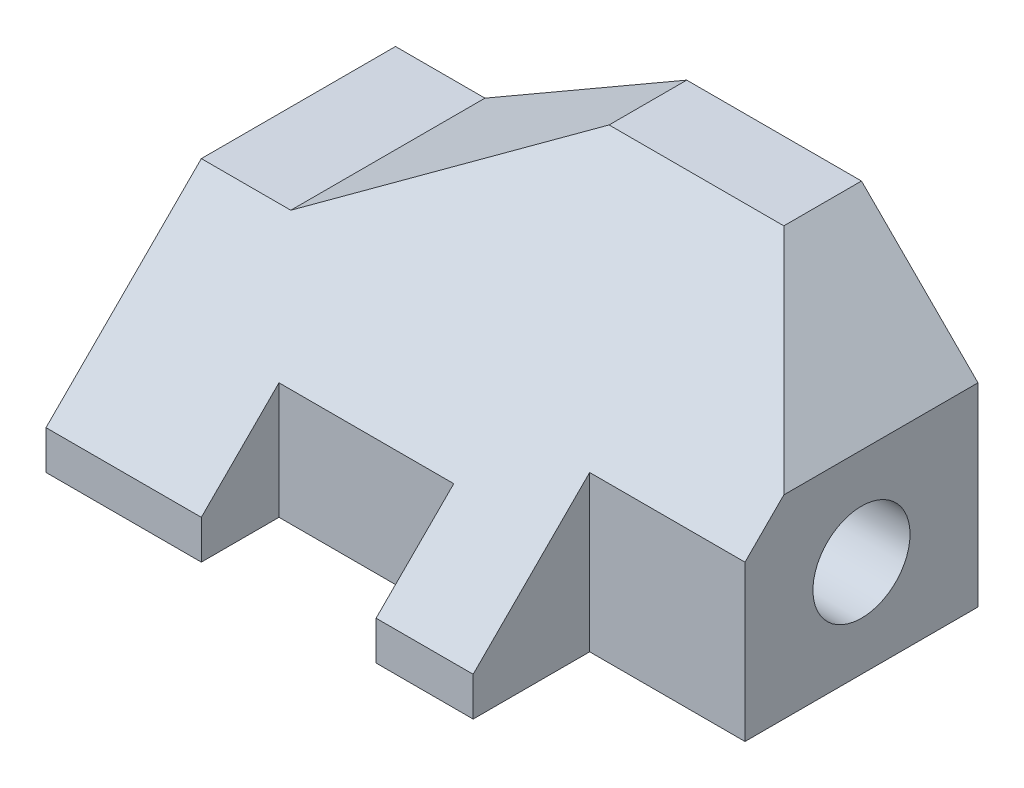
ISO-10303-21;
HEADER;
FILE_DESCRIPTION(('STEP AP214'),'2;1');
FILE_NAME('part.step','',(''),(''),'','','');
FILE_SCHEMA(('AUTOMOTIVE_DESIGN { 1 0 10303 214 1 1 1 1 }'));
ENDSEC;
DATA;
#1=APPLICATION_CONTEXT('core data for automotive mechanical design processes');
#2=APPLICATION_PROTOCOL_DEFINITION('international standard','automotive_design',2000,#1);
#3=PRODUCT_CONTEXT('',#1,'mechanical');
#4=PRODUCT('Part','Part','',(#3));
#5=PRODUCT_RELATED_PRODUCT_CATEGORY('part','',(#4));
#6=PRODUCT_DEFINITION_FORMATION('','',#4);
#7=PRODUCT_DEFINITION_CONTEXT('part definition',#1,'design');
#8=PRODUCT_DEFINITION('design','',#6,#7);
#9=PRODUCT_DEFINITION_SHAPE('','',#8);
#10=(LENGTH_UNIT() NAMED_UNIT(*) SI_UNIT(.MILLI.,.METRE.));
#11=(NAMED_UNIT(*) PLANE_ANGLE_UNIT() SI_UNIT($,.RADIAN.));
#12=(NAMED_UNIT(*) SI_UNIT($,.STERADIAN.) SOLID_ANGLE_UNIT());
#13=UNCERTAINTY_MEASURE_WITH_UNIT(LENGTH_MEASURE(1.E-05),#10,'distance_accuracy_value','');
#14=(GEOMETRIC_REPRESENTATION_CONTEXT(3) GLOBAL_UNCERTAINTY_ASSIGNED_CONTEXT((#13)) GLOBAL_UNIT_ASSIGNED_CONTEXT((#10,
#11,#12)) REPRESENTATION_CONTEXT('',''));
#15=CARTESIAN_POINT('',(0.,0.,0.));
#16=DIRECTION('',(0.,0.,1.));
#17=DIRECTION('',(1.,0.,0.));
#18=AXIS2_PLACEMENT_3D('',#15,#16,#17);
#19=CARTESIAN_POINT('',(-47.625,50.8,28.575));
#20=DIRECTION('',(0.,0.,-1.));
#21=DIRECTION('',(-1.,0.,0.));
#22=AXIS2_PLACEMENT_3D('',#19,#20,#21);
#23=PLANE('',#22);
#24=DIRECTION('',(0.,-1.,0.));
#25=VECTOR('',#24,1.);
#26=CARTESIAN_POINT('',(-22.225,127.,28.575));
#27=LINE('',#26,#25);
#28=CARTESIAN_POINT('',(-22.225,6.35000000000047,28.575));
#29=VERTEX_POINT('',#28);
#30=CARTESIAN_POINT('',(-22.225,0.,28.575));
#31=VERTEX_POINT('',#30);
#32=EDGE_CURVE('E175',#29,#31,#27,.T.);
#33=ORIENTED_EDGE('',*,*,#32,.F.);
#34=DIRECTION('',(1.,0.,0.));
#35=VECTOR('',#34,1.);
#36=CARTESIAN_POINT('',(-79.375,6.35000000000047,28.575));
#37=LINE('',#36,#35);
#38=CARTESIAN_POINT('',(-47.625,6.35000000000047,28.575));
#39=VERTEX_POINT('',#38);
#40=EDGE_CURVE('E208',#39,#29,#37,.T.);
#41=ORIENTED_EDGE('',*,*,#40,.F.);
#42=DIRECTION('',(0.,-1.,0.));
#43=VECTOR('',#42,1.);
#44=CARTESIAN_POINT('',(-47.625,50.8,28.575));
#45=LINE('',#44,#43);
#46=CARTESIAN_POINT('',(-47.625,0.,28.575));
#47=VERTEX_POINT('',#46);
#48=EDGE_CURVE('E257',#39,#47,#45,.T.);
#49=ORIENTED_EDGE('',*,*,#48,.T.);
#50=DIRECTION('',(1.,0.,0.));
#51=VECTOR('',#50,1.);
#52=CARTESIAN_POINT('',(-47.625,0.,28.575));
#53=LINE('',#52,#51);
#54=EDGE_CURVE('E258',#47,#31,#53,.T.);
#55=ORIENTED_EDGE('',*,*,#54,.T.);
#56=EDGE_LOOP('',(#33,#41,#49,#55));
#57=FACE_BOUND('',#56,.T.);
#58=ADVANCED_FACE('F43',(#57),#23,.F.);
#59=CARTESIAN_POINT('',(6.35,0.,28.575));
#60=VERTEX_POINT('',#59);
#61=CARTESIAN_POINT('',(22.225,0.,28.575));
#62=VERTEX_POINT('',#61);
#63=EDGE_CURVE('E269',#60,#62,#53,.T.);
#64=ORIENTED_EDGE('',*,*,#63,.T.);
#65=DIRECTION('',(0.,-1.,0.));
#66=VECTOR('',#65,1.);
#67=CARTESIAN_POINT('',(22.225,127.,28.575));
#68=LINE('',#67,#66);
#69=CARTESIAN_POINT('',(22.225,6.35000000000047,28.575));
#70=VERTEX_POINT('',#69);
#71=EDGE_CURVE('E179',#70,#62,#68,.T.);
#72=ORIENTED_EDGE('',*,*,#71,.F.);
#73=CARTESIAN_POINT('',(6.35,6.35000000000048,28.575));
#74=VERTEX_POINT('',#73);
#75=EDGE_CURVE('E213',#74,#70,#37,.T.);
#76=ORIENTED_EDGE('',*,*,#75,.F.);
#77=DIRECTION('',(0.,-1.,0.));
#78=VECTOR('',#77,1.);
#79=CARTESIAN_POINT('',(6.35,127.,28.575));
#80=LINE('',#79,#78);
#81=EDGE_CURVE('E197',#74,#60,#80,.T.);
#82=ORIENTED_EDGE('',*,*,#81,.T.);
#83=EDGE_LOOP('',(#64,#72,#76,#82));
#84=FACE_BOUND('',#83,.T.);
#85=ADVANCED_FACE('F354',(#84),#23,.F.);
#86=CARTESIAN_POINT('',(0.,0.,0.));
#87=DIRECTION('',(0.,-1.,0.));
#88=DIRECTION('',(0.,0.,-1.));
#89=AXIS2_PLACEMENT_3D('',#86,#87,#88);
#90=PLANE('',#89);
#91=DIRECTION('',(0.,0.,-1.));
#92=VECTOR('',#91,1.);
#93=CARTESIAN_POINT('',(22.225,0.,0.));
#94=LINE('',#93,#92);
#95=CARTESIAN_POINT('',(22.225,0.,9.52500000000001));
#96=VERTEX_POINT('',#95);
#97=EDGE_CURVE('E170',#62,#96,#94,.T.);
#98=ORIENTED_EDGE('',*,*,#97,.F.);
#99=ORIENTED_EDGE('',*,*,#63,.F.);
#100=DIRECTION('',(0.,0.,-1.));
#101=VECTOR('',#100,1.);
#102=CARTESIAN_POINT('',(6.35,0.,0.));
#103=LINE('',#102,#101);
#104=CARTESIAN_POINT('',(6.35,0.,15.875));
#105=VERTEX_POINT('',#104);
#106=EDGE_CURVE('E190',#60,#105,#103,.T.);
#107=ORIENTED_EDGE('',*,*,#106,.T.);
#108=DIRECTION('',(-1.,0.,0.));
#109=VECTOR('',#108,1.);
#110=CARTESIAN_POINT('',(0.,0.,15.875));
#111=LINE('',#110,#109);
#112=CARTESIAN_POINT('',(-22.225,0.,15.875));
#113=VERTEX_POINT('',#112);
#114=EDGE_CURVE('E165',#105,#113,#111,.T.);
#115=ORIENTED_EDGE('',*,*,#114,.T.);
#116=DIRECTION('',(0.,0.,1.));
#117=VECTOR('',#116,1.);
#118=CARTESIAN_POINT('',(-22.225,0.,0.));
#119=LINE('',#118,#117);
#120=EDGE_CURVE('E157',#113,#31,#119,.T.);
#121=ORIENTED_EDGE('',*,*,#120,.T.);
#122=ORIENTED_EDGE('',*,*,#54,.F.);
#123=DIRECTION('',(0.,0.,1.));
#124=VECTOR('',#123,1.);
#125=CARTESIAN_POINT('',(-47.625,0.,28.575));
#126=LINE('',#125,#124);
#127=CARTESIAN_POINT('',(-47.625,0.,-28.575));
#128=VERTEX_POINT('',#127);
#129=EDGE_CURVE('E265',#128,#47,#126,.T.);
#130=ORIENTED_EDGE('',*,*,#129,.F.);
#131=DIRECTION('',(-1.,0.,0.));
#132=VECTOR('',#131,1.);
#133=CARTESIAN_POINT('',(-47.625,0.,-28.575));
#134=LINE('',#133,#132);
#135=CARTESIAN_POINT('',(47.625,0.,-28.575));
#136=VERTEX_POINT('',#135);
#137=EDGE_CURVE('E261',#136,#128,#134,.T.);
#138=ORIENTED_EDGE('',*,*,#137,.F.);
#139=DIRECTION('',(0.,0.,-1.));
#140=VECTOR('',#139,1.);
#141=CARTESIAN_POINT('',(47.625,0.,28.575));
#142=LINE('',#141,#140);
#143=CARTESIAN_POINT('',(47.625,0.,9.52500000000001));
#144=VERTEX_POINT('',#143);
#145=EDGE_CURVE('E252',#144,#136,#142,.T.);
#146=ORIENTED_EDGE('',*,*,#145,.F.);
#147=DIRECTION('',(1.,0.,0.));
#148=VECTOR('',#147,1.);
#149=CARTESIAN_POINT('',(0.,0.,9.52500000000001));
#150=LINE('',#149,#148);
#151=EDGE_CURVE('E174',#96,#144,#150,.T.);
#152=ORIENTED_EDGE('',*,*,#151,.F.);
#153=EDGE_LOOP('',(#98,#99,#107,#115,#121,#122,#130,#138,#146,#152));
#154=FACE_BOUND('',#153,.T.);
#155=ADVANCED_FACE('F344',(#154),#90,.T.);
#156=CARTESIAN_POINT('',(-79.375,50.8,-15.875));
#157=DIRECTION('',(0.,-0.707106781186551,-0.707106781186544));
#158=DIRECTION('',(0.,0.707106781186544,-0.707106781186551));
#159=AXIS2_PLACEMENT_3D('',#156,#157,#158);
#160=PLANE('',#159);
#161=ORIENTED_EDGE('',*,*,#75,.T.);
#162=DIRECTION('',(0.,0.707106781186544,-0.707106781186551));
#163=VECTOR('',#162,1.);
#164=CARTESIAN_POINT('',(22.225,50.8,-15.875));
#165=LINE('',#164,#163);
#166=CARTESIAN_POINT('',(22.225,25.4000000000003,9.52500000000001));
#167=VERTEX_POINT('',#166);
#168=EDGE_CURVE('E11',#70,#167,#165,.T.);
#169=ORIENTED_EDGE('',*,*,#168,.T.);
#170=DIRECTION('',(1.,0.,0.));
#171=VECTOR('',#170,1.);
#172=CARTESIAN_POINT('',(-79.375,25.4000000000003,9.52500000000001));
#173=LINE('',#172,#171);
#174=CARTESIAN_POINT('',(47.625,25.4000000000003,9.525));
#175=VERTEX_POINT('',#174);
#176=EDGE_CURVE('E52',#167,#175,#173,.T.);
#177=ORIENTED_EDGE('',*,*,#176,.T.);
#178=DIRECTION('',(0.,0.707106781186544,-0.707106781186551));
#179=VECTOR('',#178,1.);
#180=CARTESIAN_POINT('',(47.625,50.8,-15.875));
#181=LINE('',#180,#179);
#182=CARTESIAN_POINT('',(47.625,31.7500000000002,3.175));
#183=VERTEX_POINT('',#182);
#184=EDGE_CURVE('E182',#175,#183,#181,.T.);
#185=ORIENTED_EDGE('',*,*,#184,.T.);
#186=DIRECTION('',(0.577350269189628,-0.577350269189622,0.577350269189628));
#187=VECTOR('',#186,1.);
#188=CARTESIAN_POINT('',(1.05833333333313,78.3166666666666,-43.3916666666669));
#189=LINE('',#188,#187);
#190=CARTESIAN_POINT('',(28.575,50.8,-15.875));
#191=VERTEX_POINT('',#190);
#192=EDGE_CURVE('E289',#191,#183,#189,.T.);
#193=ORIENTED_EDGE('',*,*,#192,.F.);
#194=DIRECTION('',(1.,0.,0.));
#195=VECTOR('',#194,1.);
#196=CARTESIAN_POINT('',(-79.375,50.8,-15.875));
#197=LINE('',#196,#195);
#198=CARTESIAN_POINT('',(0.,50.8,-15.875));
#199=VERTEX_POINT('',#198);
#200=EDGE_CURVE('E207',#199,#191,#197,.T.);
#201=ORIENTED_EDGE('',*,*,#200,.F.);
#202=DIRECTION('',(0.774596669241486,0.447213595499953,-0.447213595499958));
#203=VECTOR('',#202,1.);
#204=CARTESIAN_POINT('',(28.5961588329623,67.3099999999998,-32.385));
#205=LINE('',#204,#203);
#206=CARTESIAN_POINT('',(-32.9955678841876,31.75,3.17500000000021));
#207=VERTEX_POINT('',#206);
#208=EDGE_CURVE('E212',#207,#199,#205,.T.);
#209=ORIENTED_EDGE('',*,*,#208,.F.);
#210=DIRECTION('',(1.,0.,0.));
#211=VECTOR('',#210,1.);
#212=CARTESIAN_POINT('',(-32.9955678841876,31.75,3.17500000000021));
#213=LINE('',#212,#211);
#214=CARTESIAN_POINT('',(-47.625,31.75,3.17500000000021));
#215=VERTEX_POINT('',#214);
#216=EDGE_CURVE('E220',#215,#207,#213,.T.);
#217=ORIENTED_EDGE('',*,*,#216,.F.);
#218=DIRECTION('',(0.,0.707106781186544,-0.707106781186551));
#219=VECTOR('',#218,1.);
#220=CARTESIAN_POINT('',(-47.625,28.575,6.35000000000024));
#221=LINE('',#220,#219);
#222=EDGE_CURVE('E224',#39,#215,#221,.T.);
#223=ORIENTED_EDGE('',*,*,#222,.F.);
#224=ORIENTED_EDGE('',*,*,#40,.T.);
#225=DIRECTION('',(0.,-0.707106781186544,0.707106781186551));
#226=VECTOR('',#225,1.);
#227=CARTESIAN_POINT('',(-22.225,50.8,-15.875));
#228=LINE('',#227,#226);
#229=CARTESIAN_POINT('',(-22.225,19.0500000000003,15.875));
#230=VERTEX_POINT('',#229);
#231=EDGE_CURVE('E299',#230,#29,#228,.T.);
#232=ORIENTED_EDGE('',*,*,#231,.F.);
#233=DIRECTION('',(-1.,0.,0.));
#234=VECTOR('',#233,1.);
#235=CARTESIAN_POINT('',(-79.375,19.0500000000003,15.875));
#236=LINE('',#235,#234);
#237=CARTESIAN_POINT('',(6.34999999999999,19.0500000000003,15.875));
#238=VERTEX_POINT('',#237);
#239=EDGE_CURVE('E293',#238,#230,#236,.T.);
#240=ORIENTED_EDGE('',*,*,#239,.F.);
#241=DIRECTION('',(0.,0.707106781186544,-0.707106781186551));
#242=VECTOR('',#241,1.);
#243=CARTESIAN_POINT('',(6.35000000000001,50.8,-15.875));
#244=LINE('',#243,#242);
#245=EDGE_CURVE('E296',#74,#238,#244,.T.);
#246=ORIENTED_EDGE('',*,*,#245,.F.);
#247=EDGE_LOOP('',(#161,#169,#177,#185,#193,#201,#209,#217,#223,#224,#232,#240,#246));
#248=FACE_BOUND('',#247,.T.);
#249=ADVANCED_FACE('F307',(#248),#160,.F.);
#250=CARTESIAN_POINT('',(47.625,50.8,28.575));
#251=DIRECTION('',(-1.,0.,0.));
#252=DIRECTION('',(0.,0.,1.));
#253=AXIS2_PLACEMENT_3D('',#250,#251,#252);
#254=PLANE('',#253);
#255=CARTESIAN_POINT('',(47.625,15.875,-9.525));
#256=DIRECTION('',(1.,0.,0.));
#257=DIRECTION('',(0.,0.,-1.));
#258=AXIS2_PLACEMENT_3D('',#255,#256,#257);
#259=CIRCLE('',#258,7.9375);
#260=CARTESIAN_POINT('',(47.625,15.875,-17.4625));
#261=VERTEX_POINT('',#260);
#262=EDGE_CURVE('E158',#261,#261,#259,.T.);
#263=ORIENTED_EDGE('',*,*,#262,.F.);
#264=EDGE_LOOP('',(#263));
#265=FACE_BOUND('',#264,.T.);
#266=ORIENTED_EDGE('',*,*,#184,.F.);
#267=DIRECTION('',(0.,-1.,0.));
#268=VECTOR('',#267,1.);
#269=CARTESIAN_POINT('',(47.625,127.,9.52500000000001));
#270=LINE('',#269,#268);
#271=EDGE_CURVE('E67',#175,#144,#270,.T.);
#272=ORIENTED_EDGE('',*,*,#271,.T.);
#273=ORIENTED_EDGE('',*,*,#145,.T.);
#274=DIRECTION('',(0.,-1.,0.));
#275=VECTOR('',#274,1.);
#276=CARTESIAN_POINT('',(47.625,50.8,-28.575));
#277=LINE('',#276,#275);
#278=CARTESIAN_POINT('',(47.625,31.7500000000002,-28.575));
#279=VERTEX_POINT('',#278);
#280=EDGE_CURVE('E278',#279,#136,#277,.T.);
#281=ORIENTED_EDGE('',*,*,#280,.F.);
#282=DIRECTION('',(0.,0.,1.));
#283=VECTOR('',#282,1.);
#284=CARTESIAN_POINT('',(47.625,31.7500000000002,-98.425));
#285=LINE('',#284,#283);
#286=EDGE_CURVE('E229',#279,#183,#285,.T.);
#287=ORIENTED_EDGE('',*,*,#286,.T.);
#288=EDGE_LOOP('',(#266,#272,#273,#281,#287));
#289=FACE_BOUND('',#288,.T.);
#290=ADVANCED_FACE('F45',(#265,#289),#254,.F.);
#291=CARTESIAN_POINT('',(-47.625,50.8,-28.575));
#292=DIRECTION('',(0.,0.,1.));
#293=DIRECTION('',(1.,0.,0.));
#294=AXIS2_PLACEMENT_3D('',#291,#292,#293);
#295=PLANE('',#294);
#296=DIRECTION('',(-1.,0.,0.));
#297=VECTOR('',#296,1.);
#298=CARTESIAN_POINT('',(-47.625,50.8,-28.575));
#299=LINE('',#298,#297);
#300=CARTESIAN_POINT('',(28.575,50.8,-28.575));
#301=VERTEX_POINT('',#300);
#302=CARTESIAN_POINT('',(0.,50.8,-28.575));
#303=VERTEX_POINT('',#302);
#304=EDGE_CURVE('E253',#301,#303,#299,.T.);
#305=ORIENTED_EDGE('',*,*,#304,.F.);
#306=DIRECTION('',(0.707106781186551,-0.707106781186544,0.));
#307=VECTOR('',#306,1.);
#308=CARTESIAN_POINT('',(-9.52500000000042,88.9,-28.575));
#309=LINE('',#308,#307);
#310=EDGE_CURVE('E244',#301,#279,#309,.T.);
#311=ORIENTED_EDGE('',*,*,#310,.T.);
#312=ORIENTED_EDGE('',*,*,#280,.T.);
#313=ORIENTED_EDGE('',*,*,#137,.T.);
#314=DIRECTION('',(0.,-1.,0.));
#315=VECTOR('',#314,1.);
#316=CARTESIAN_POINT('',(-47.625,50.8,-28.575));
#317=LINE('',#316,#315);
#318=CARTESIAN_POINT('',(-47.625,31.75,-28.575));
#319=VERTEX_POINT('',#318);
#320=EDGE_CURVE('E275',#319,#128,#317,.T.);
#321=ORIENTED_EDGE('',*,*,#320,.F.);
#322=DIRECTION('',(1.,0.,0.));
#323=VECTOR('',#322,1.);
#324=CARTESIAN_POINT('',(-47.625,31.75,-28.575));
#325=LINE('',#324,#323);
#326=CARTESIAN_POINT('',(-32.9955678841876,31.75,-28.575));
#327=VERTEX_POINT('',#326);
#328=EDGE_CURVE('E248',#319,#327,#325,.T.);
#329=ORIENTED_EDGE('',*,*,#328,.T.);
#330=DIRECTION('',(0.866025403784442,0.499999999999995,0.));
#331=VECTOR('',#330,1.);
#332=CARTESIAN_POINT('',(-35.7187500000002,30.1777700723832,-28.575));
#333=LINE('',#332,#331);
#334=EDGE_CURVE('E233',#327,#303,#333,.T.);
#335=ORIENTED_EDGE('',*,*,#334,.T.);
#336=EDGE_LOOP('',(#305,#311,#312,#313,#321,#329,#335));
#337=FACE_BOUND('',#336,.T.);
#338=ADVANCED_FACE('F318',(#337),#295,.F.);
#339=CARTESIAN_POINT('',(-47.625,50.8,28.575));
#340=DIRECTION('',(1.,0.,0.));
#341=DIRECTION('',(0.,0.,-1.));
#342=AXIS2_PLACEMENT_3D('',#339,#340,#341);
#343=PLANE('',#342);
#344=ORIENTED_EDGE('',*,*,#48,.F.);
#345=ORIENTED_EDGE('',*,*,#222,.T.);
#346=DIRECTION('',(0.,0.,1.));
#347=VECTOR('',#346,1.);
#348=CARTESIAN_POINT('',(-47.625,31.75,-98.425));
#349=LINE('',#348,#347);
#350=EDGE_CURVE('E228',#319,#215,#349,.T.);
#351=ORIENTED_EDGE('',*,*,#350,.F.);
#352=ORIENTED_EDGE('',*,*,#320,.T.);
#353=ORIENTED_EDGE('',*,*,#129,.T.);
#354=EDGE_LOOP('',(#344,#345,#351,#352,#353));
#355=FACE_BOUND('',#354,.T.);
#356=ADVANCED_FACE('F332',(#355),#343,.F.);
#357=CARTESIAN_POINT('',(0.,50.8,0.));
#358=DIRECTION('',(0.,-1.,0.));
#359=DIRECTION('',(0.,0.,-1.));
#360=AXIS2_PLACEMENT_3D('',#357,#358,#359);
#361=PLANE('',#360);
#362=DIRECTION('',(0.,0.,1.));
#363=VECTOR('',#362,1.);
#364=CARTESIAN_POINT('',(0.,50.8,0.));
#365=LINE('',#364,#363);
#366=EDGE_CURVE('E282',#303,#199,#365,.T.);
#367=ORIENTED_EDGE('',*,*,#366,.T.);
#368=ORIENTED_EDGE('',*,*,#200,.T.);
#369=DIRECTION('',(0.,0.,-1.));
#370=VECTOR('',#369,1.);
#371=CARTESIAN_POINT('',(28.575,50.8,0.));
#372=LINE('',#371,#370);
#373=EDGE_CURVE('E286',#191,#301,#372,.T.);
#374=ORIENTED_EDGE('',*,*,#373,.T.);
#375=ORIENTED_EDGE('',*,*,#304,.T.);
#376=EDGE_LOOP('',(#367,#368,#374,#375));
#377=FACE_BOUND('',#376,.T.);
#378=ADVANCED_FACE('F321',(#377),#361,.F.);
#379=CARTESIAN_POINT('',(-32.9955678841876,31.75,-98.425));
#380=DIRECTION('',(0.,-1.,0.));
#381=DIRECTION('',(0.,0.,-1.));
#382=AXIS2_PLACEMENT_3D('',#379,#380,#381);
#383=PLANE('',#382);
#384=ORIENTED_EDGE('',*,*,#350,.T.);
#385=ORIENTED_EDGE('',*,*,#216,.T.);
#386=DIRECTION('',(0.,0.,1.));
#387=VECTOR('',#386,1.);
#388=CARTESIAN_POINT('',(-32.9955678841876,31.75,-98.425));
#389=LINE('',#388,#387);
#390=EDGE_CURVE('E234',#327,#207,#389,.T.);
#391=ORIENTED_EDGE('',*,*,#390,.F.);
#392=ORIENTED_EDGE('',*,*,#328,.F.);
#393=EDGE_LOOP('',(#384,#385,#391,#392));
#394=FACE_BOUND('',#393,.T.);
#395=ADVANCED_FACE('F326',(#394),#383,.F.);
#396=CARTESIAN_POINT('',(0.,50.8,-98.425));
#397=DIRECTION('',(0.499999999999995,-0.866025403784442,0.));
#398=DIRECTION('',(0.866025403784442,0.499999999999995,0.));
#399=AXIS2_PLACEMENT_3D('',#396,#397,#398);
#400=PLANE('',#399);
#401=ORIENTED_EDGE('',*,*,#390,.T.);
#402=ORIENTED_EDGE('',*,*,#208,.T.);
#403=ORIENTED_EDGE('',*,*,#366,.F.);
#404=ORIENTED_EDGE('',*,*,#334,.F.);
#405=EDGE_LOOP('',(#401,#402,#403,#404));
#406=FACE_BOUND('',#405,.T.);
#407=ADVANCED_FACE('F323',(#406),#400,.F.);
#408=CARTESIAN_POINT('',(28.575,50.8,-98.425));
#409=DIRECTION('',(-0.707106781186544,-0.707106781186551,0.));
#410=DIRECTION('',(0.707106781186551,-0.707106781186544,0.));
#411=AXIS2_PLACEMENT_3D('',#408,#409,#410);
#412=PLANE('',#411);
#413=ORIENTED_EDGE('',*,*,#373,.F.);
#414=ORIENTED_EDGE('',*,*,#192,.T.);
#415=ORIENTED_EDGE('',*,*,#286,.F.);
#416=ORIENTED_EDGE('',*,*,#310,.F.);
#417=EDGE_LOOP('',(#413,#414,#415,#416));
#418=FACE_BOUND('',#417,.T.);
#419=ADVANCED_FACE('F315',(#418),#412,.F.);
#420=CARTESIAN_POINT('',(-22.225,127.,0.));
#421=DIRECTION('',(1.,0.,0.));
#422=DIRECTION('',(0.,0.,-1.));
#423=AXIS2_PLACEMENT_3D('',#420,#421,#422);
#424=PLANE('',#423);
#425=ORIENTED_EDGE('',*,*,#231,.T.);
#426=ORIENTED_EDGE('',*,*,#32,.T.);
#427=ORIENTED_EDGE('',*,*,#120,.F.);
#428=DIRECTION('',(0.,-1.,0.));
#429=VECTOR('',#428,1.);
#430=CARTESIAN_POINT('',(-22.225,127.,15.875));
#431=LINE('',#430,#429);
#432=EDGE_CURVE('E194',#230,#113,#431,.T.);
#433=ORIENTED_EDGE('',*,*,#432,.F.);
#434=EDGE_LOOP('',(#425,#426,#427,#433));
#435=FACE_BOUND('',#434,.T.);
#436=ADVANCED_FACE('F340',(#435),#424,.T.);
#437=CARTESIAN_POINT('',(6.35,127.,0.));
#438=DIRECTION('',(-1.,0.,0.));
#439=DIRECTION('',(0.,0.,1.));
#440=AXIS2_PLACEMENT_3D('',#437,#438,#439);
#441=PLANE('',#440);
#442=ORIENTED_EDGE('',*,*,#245,.T.);
#443=DIRECTION('',(0.,-1.,0.));
#444=VECTOR('',#443,1.);
#445=CARTESIAN_POINT('',(6.35,127.,15.875));
#446=LINE('',#445,#444);
#447=EDGE_CURVE('E59',#238,#105,#446,.T.);
#448=ORIENTED_EDGE('',*,*,#447,.T.);
#449=ORIENTED_EDGE('',*,*,#106,.F.);
#450=ORIENTED_EDGE('',*,*,#81,.F.);
#451=EDGE_LOOP('',(#442,#448,#449,#450));
#452=FACE_BOUND('',#451,.T.);
#453=ADVANCED_FACE('F498',(#452),#441,.T.);
#454=CARTESIAN_POINT('',(0.,127.,15.875));
#455=DIRECTION('',(0.,0.,1.));
#456=DIRECTION('',(1.,0.,0.));
#457=AXIS2_PLACEMENT_3D('',#454,#455,#456);
#458=PLANE('',#457);
#459=ORIENTED_EDGE('',*,*,#239,.T.);
#460=ORIENTED_EDGE('',*,*,#432,.T.);
#461=ORIENTED_EDGE('',*,*,#114,.F.);
#462=ORIENTED_EDGE('',*,*,#447,.F.);
#463=EDGE_LOOP('',(#459,#460,#461,#462));
#464=FACE_BOUND('',#463,.T.);
#465=ADVANCED_FACE('F346',(#464),#458,.T.);
#466=CARTESIAN_POINT('',(22.225,127.,0.));
#467=DIRECTION('',(-1.,0.,0.));
#468=DIRECTION('',(0.,0.,1.));
#469=AXIS2_PLACEMENT_3D('',#466,#467,#468);
#470=PLANE('',#469);
#471=ORIENTED_EDGE('',*,*,#71,.T.);
#472=ORIENTED_EDGE('',*,*,#97,.T.);
#473=DIRECTION('',(0.,-1.,0.));
#474=VECTOR('',#473,1.);
#475=CARTESIAN_POINT('',(22.225,127.,9.52500000000001));
#476=LINE('',#475,#474);
#477=EDGE_CURVE('E178',#167,#96,#476,.T.);
#478=ORIENTED_EDGE('',*,*,#477,.F.);
#479=ORIENTED_EDGE('',*,*,#168,.F.);
#480=EDGE_LOOP('',(#471,#472,#478,#479));
#481=FACE_BOUND('',#480,.T.);
#482=ADVANCED_FACE('F443',(#481),#470,.F.);
#483=CARTESIAN_POINT('',(0.,127.,9.52500000000001));
#484=DIRECTION('',(0.,0.,-1.));
#485=DIRECTION('',(-1.,0.,0.));
#486=AXIS2_PLACEMENT_3D('',#483,#484,#485);
#487=PLANE('',#486);
#488=ORIENTED_EDGE('',*,*,#477,.T.);
#489=ORIENTED_EDGE('',*,*,#151,.T.);
#490=ORIENTED_EDGE('',*,*,#271,.F.);
#491=ORIENTED_EDGE('',*,*,#176,.F.);
#492=EDGE_LOOP('',(#488,#489,#490,#491));
#493=FACE_BOUND('',#492,.T.);
#494=ADVANCED_FACE('F150',(#493),#487,.F.);
#495=CARTESIAN_POINT('',(15.875,15.875,-9.525));
#496=DIRECTION('',(1.,0.,0.));
#497=DIRECTION('',(0.,0.,-1.));
#498=AXIS2_PLACEMENT_3D('',#495,#496,#497);
#499=CONICAL_SURFACE('',#498,7.93749999999999,1.02974425867665);
#500=CARTESIAN_POINT('',(11.1056688364687,15.875,-9.525));
#501=VERTEX_POINT('',#500);
#502=VERTEX_LOOP('',#501);
#503=FACE_BOUND('',#502,.T.);
#504=CARTESIAN_POINT('',(15.875,15.875,-9.525));
#505=DIRECTION('',(1.,0.,0.));
#506=DIRECTION('',(0.,0.,-1.));
#507=AXIS2_PLACEMENT_3D('',#504,#505,#506);
#508=CIRCLE('',#507,7.93749999999999);
#509=CARTESIAN_POINT('',(15.875,15.875,-17.4625));
#510=VERTEX_POINT('',#509);
#511=EDGE_CURVE('E154',#510,#510,#508,.T.);
#512=ORIENTED_EDGE('',*,*,#511,.T.);
#513=EDGE_LOOP('',(#512));
#514=FACE_BOUND('',#513,.T.);
#515=ADVANCED_FACE('F146',(#503,#514),#499,.F.);
#516=CARTESIAN_POINT('',(47.625,15.875,-9.525));
#517=DIRECTION('',(1.,0.,0.));
#518=DIRECTION('',(0.,0.,-1.));
#519=AXIS2_PLACEMENT_3D('',#516,#517,#518);
#520=CYLINDRICAL_SURFACE('',#519,7.93749999999999);
#521=ORIENTED_EDGE('',*,*,#511,.F.);
#522=EDGE_LOOP('',(#521));
#523=FACE_BOUND('',#522,.T.);
#524=ORIENTED_EDGE('',*,*,#262,.T.);
#525=EDGE_LOOP('',(#524));
#526=FACE_BOUND('',#525,.T.);
#527=ADVANCED_FACE('F149',(#523,#526),#520,.F.);
#528=CLOSED_SHELL('',(#58,#85,#155,#249,#290,#338,#356,#378,#395,#407,#419,#436,#453,#465,#482,
#494,#515,#527));
#529=MANIFOLD_SOLID_BREP('B2',#528);
#530=ADVANCED_BREP_SHAPE_REPRESENTATION('',(#18,#529),#14);
#531=SHAPE_DEFINITION_REPRESENTATION(#9,#530);
ENDSEC;
END-ISO-10303-21;
